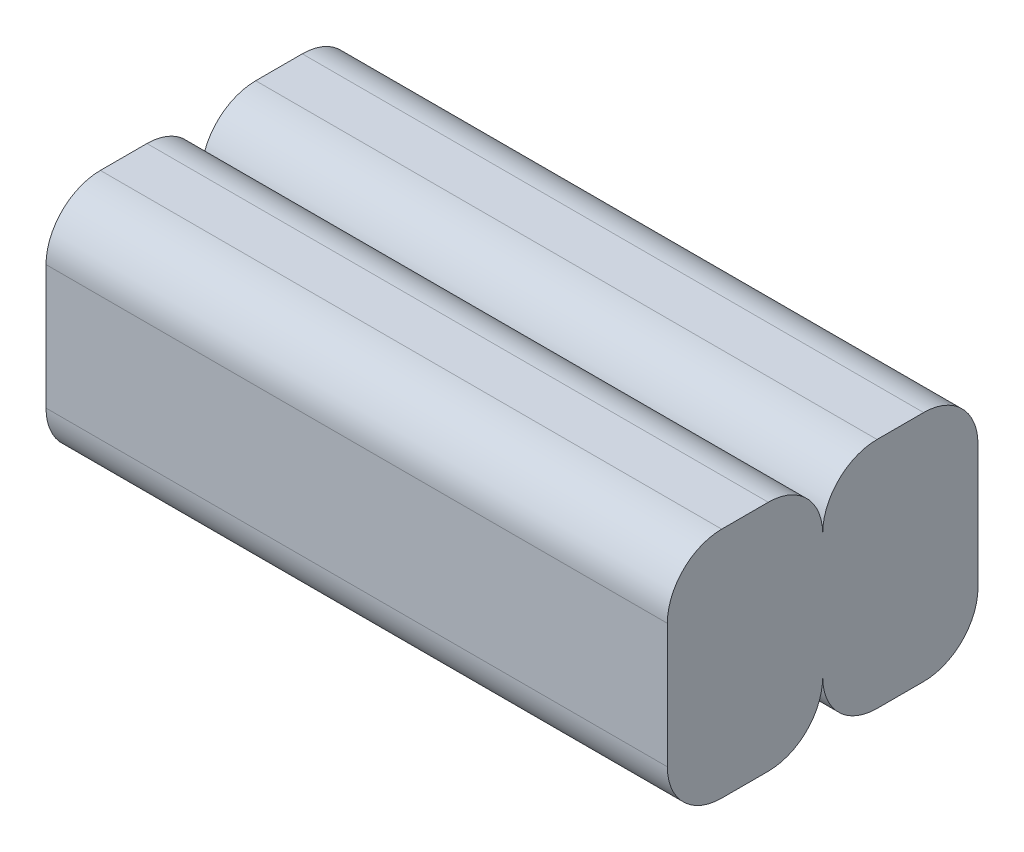
ISO-10303-21;
HEADER;
FILE_DESCRIPTION(('STEP AP214'),'2;1');
FILE_NAME('part.step','',(''),(''),'','','');
FILE_SCHEMA(('AUTOMOTIVE_DESIGN { 1 0 10303 214 1 1 1 1 }'));
ENDSEC;
DATA;
#1=APPLICATION_CONTEXT('core data for automotive mechanical design processes');
#2=APPLICATION_PROTOCOL_DEFINITION('international standard','automotive_design',2000,#1);
#3=PRODUCT_CONTEXT('',#1,'mechanical');
#4=PRODUCT('Part','Part','',(#3));
#5=PRODUCT_RELATED_PRODUCT_CATEGORY('part','',(#4));
#6=PRODUCT_DEFINITION_FORMATION('','',#4);
#7=PRODUCT_DEFINITION_CONTEXT('part definition',#1,'design');
#8=PRODUCT_DEFINITION('design','',#6,#7);
#9=PRODUCT_DEFINITION_SHAPE('','',#8);
#10=(LENGTH_UNIT() NAMED_UNIT(*) SI_UNIT(.MILLI.,.METRE.));
#11=(NAMED_UNIT(*) PLANE_ANGLE_UNIT() SI_UNIT($,.RADIAN.));
#12=(NAMED_UNIT(*) SI_UNIT($,.STERADIAN.) SOLID_ANGLE_UNIT());
#13=UNCERTAINTY_MEASURE_WITH_UNIT(LENGTH_MEASURE(1.E-05),#10,'distance_accuracy_value','');
#14=(GEOMETRIC_REPRESENTATION_CONTEXT(3) GLOBAL_UNCERTAINTY_ASSIGNED_CONTEXT((#13)) GLOBAL_UNIT_ASSIGNED_CONTEXT((#10,
#11,#12)) REPRESENTATION_CONTEXT('',''));
#15=CARTESIAN_POINT('',(0.,0.,0.));
#16=DIRECTION('',(0.,0.,1.));
#17=DIRECTION('',(1.,0.,0.));
#18=AXIS2_PLACEMENT_3D('',#15,#16,#17);
#19=CARTESIAN_POINT('',(80.,-8.,13.));
#20=DIRECTION('',(1.,0.,0.));
#21=DIRECTION('',(0.,0.,-1.));
#22=AXIS2_PLACEMENT_3D('',#19,#20,#21);
#23=CYLINDRICAL_SURFACE('',#22,7.);
#24=DIRECTION('',(1.,0.,0.));
#25=VECTOR('',#24,1.);
#26=CARTESIAN_POINT('',(80.,-8.,20.));
#27=LINE('',#26,#25);
#28=CARTESIAN_POINT('',(0.,-8.,20.));
#29=VERTEX_POINT('',#28);
#30=CARTESIAN_POINT('',(80.,-8.,20.));
#31=VERTEX_POINT('',#30);
#32=EDGE_CURVE('E237',#29,#31,#27,.T.);
#33=ORIENTED_EDGE('',*,*,#32,.F.);
#34=CARTESIAN_POINT('',(0.,-8.,13.));
#35=DIRECTION('',(1.,0.,0.));
#36=DIRECTION('',(0.,0.,-1.));
#37=AXIS2_PLACEMENT_3D('',#34,#35,#36);
#38=CIRCLE('',#37,7.);
#39=CARTESIAN_POINT('',(0.,-15.,13.));
#40=VERTEX_POINT('',#39);
#41=EDGE_CURVE('E45',#40,#29,#38,.F.);
#42=ORIENTED_EDGE('',*,*,#41,.F.);
#43=DIRECTION('',(1.,0.,0.));
#44=VECTOR('',#43,1.);
#45=CARTESIAN_POINT('',(80.,-15.,13.));
#46=LINE('',#45,#44);
#47=CARTESIAN_POINT('',(80.,-15.,13.));
#48=VERTEX_POINT('',#47);
#49=EDGE_CURVE('E240',#48,#40,#46,.F.);
#50=ORIENTED_EDGE('',*,*,#49,.F.);
#51=CARTESIAN_POINT('',(80.,-8.,13.));
#52=DIRECTION('',(1.,0.,0.));
#53=DIRECTION('',(0.,0.,-1.));
#54=AXIS2_PLACEMENT_3D('',#51,#52,#53);
#55=CIRCLE('',#54,7.);
#56=EDGE_CURVE('E11',#31,#48,#55,.T.);
#57=ORIENTED_EDGE('',*,*,#56,.F.);
#58=EDGE_LOOP('',(#33,#42,#50,#57));
#59=FACE_BOUND('',#58,.T.);
#60=ADVANCED_FACE('F38',(#59),#23,.T.);
#61=CARTESIAN_POINT('',(80.,-8.,-13.));
#62=DIRECTION('',(-1.,0.,0.));
#63=DIRECTION('',(0.,0.,1.));
#64=AXIS2_PLACEMENT_3D('',#61,#62,#63);
#65=CYLINDRICAL_SURFACE('',#64,7.);
#66=DIRECTION('',(-1.,0.,0.));
#67=VECTOR('',#66,1.);
#68=CARTESIAN_POINT('',(80.,-8.,-20.));
#69=LINE('',#68,#67);
#70=CARTESIAN_POINT('',(80.,-8.,-20.));
#71=VERTEX_POINT('',#70);
#72=CARTESIAN_POINT('',(0.,-8.,-20.));
#73=VERTEX_POINT('',#72);
#74=EDGE_CURVE('E227',#71,#73,#69,.T.);
#75=ORIENTED_EDGE('',*,*,#74,.F.);
#76=CARTESIAN_POINT('',(80.,-8.,-13.));
#77=DIRECTION('',(1.,0.,0.));
#78=DIRECTION('',(0.,0.,-1.));
#79=AXIS2_PLACEMENT_3D('',#76,#77,#78);
#80=CIRCLE('',#79,7.);
#81=CARTESIAN_POINT('',(80.,-15.,-13.));
#82=VERTEX_POINT('',#81);
#83=EDGE_CURVE('E233',#82,#71,#80,.T.);
#84=ORIENTED_EDGE('',*,*,#83,.F.);
#85=DIRECTION('',(-1.,0.,0.));
#86=VECTOR('',#85,1.);
#87=CARTESIAN_POINT('',(80.,-15.,-13.));
#88=LINE('',#87,#86);
#89=CARTESIAN_POINT('',(0.,-15.,-13.));
#90=VERTEX_POINT('',#89);
#91=EDGE_CURVE('E230',#90,#82,#88,.F.);
#92=ORIENTED_EDGE('',*,*,#91,.F.);
#93=CARTESIAN_POINT('',(0.,-8.,-13.));
#94=DIRECTION('',(1.,0.,0.));
#95=DIRECTION('',(0.,0.,-1.));
#96=AXIS2_PLACEMENT_3D('',#93,#94,#95);
#97=CIRCLE('',#96,7.);
#98=EDGE_CURVE('E235',#73,#90,#97,.F.);
#99=ORIENTED_EDGE('',*,*,#98,.F.);
#100=EDGE_LOOP('',(#75,#84,#92,#99));
#101=FACE_BOUND('',#100,.T.);
#102=ADVANCED_FACE('F285',(#101),#65,.T.);
#103=CARTESIAN_POINT('',(80.,8.,13.));
#104=DIRECTION('',(1.,0.,0.));
#105=DIRECTION('',(0.,0.,-1.));
#106=AXIS2_PLACEMENT_3D('',#103,#104,#105);
#107=CYLINDRICAL_SURFACE('',#106,7.);
#108=DIRECTION('',(1.,0.,0.));
#109=VECTOR('',#108,1.);
#110=CARTESIAN_POINT('',(80.,15.,13.));
#111=LINE('',#110,#109);
#112=CARTESIAN_POINT('',(0.,15.,13.));
#113=VERTEX_POINT('',#112);
#114=CARTESIAN_POINT('',(80.,15.,13.));
#115=VERTEX_POINT('',#114);
#116=EDGE_CURVE('E217',#113,#115,#111,.T.);
#117=ORIENTED_EDGE('',*,*,#116,.F.);
#118=CARTESIAN_POINT('',(0.,8.,13.));
#119=DIRECTION('',(1.,0.,0.));
#120=DIRECTION('',(0.,0.,-1.));
#121=AXIS2_PLACEMENT_3D('',#118,#119,#120);
#122=CIRCLE('',#121,7.);
#123=CARTESIAN_POINT('',(0.,8.,20.));
#124=VERTEX_POINT('',#123);
#125=EDGE_CURVE('E223',#124,#113,#122,.F.);
#126=ORIENTED_EDGE('',*,*,#125,.F.);
#127=DIRECTION('',(1.,0.,0.));
#128=VECTOR('',#127,1.);
#129=CARTESIAN_POINT('',(80.,8.,20.));
#130=LINE('',#129,#128);
#131=CARTESIAN_POINT('',(80.,8.,20.));
#132=VERTEX_POINT('',#131);
#133=EDGE_CURVE('E220',#132,#124,#130,.F.);
#134=ORIENTED_EDGE('',*,*,#133,.F.);
#135=CARTESIAN_POINT('',(80.,8.,13.));
#136=DIRECTION('',(1.,0.,0.));
#137=DIRECTION('',(0.,0.,-1.));
#138=AXIS2_PLACEMENT_3D('',#135,#136,#137);
#139=CIRCLE('',#138,7.);
#140=EDGE_CURVE('E225',#115,#132,#139,.T.);
#141=ORIENTED_EDGE('',*,*,#140,.F.);
#142=EDGE_LOOP('',(#117,#126,#134,#141));
#143=FACE_BOUND('',#142,.T.);
#144=ADVANCED_FACE('F250',(#143),#107,.T.);
#145=CARTESIAN_POINT('',(80.,8.,-13.));
#146=DIRECTION('',(-1.,0.,0.));
#147=DIRECTION('',(0.,0.,1.));
#148=AXIS2_PLACEMENT_3D('',#145,#146,#147);
#149=CYLINDRICAL_SURFACE('',#148,7.);
#150=DIRECTION('',(-1.,0.,0.));
#151=VECTOR('',#150,1.);
#152=CARTESIAN_POINT('',(80.,15.,-13.));
#153=LINE('',#152,#151);
#154=CARTESIAN_POINT('',(80.,15.,-13.));
#155=VERTEX_POINT('',#154);
#156=CARTESIAN_POINT('',(0.,15.,-13.));
#157=VERTEX_POINT('',#156);
#158=EDGE_CURVE('E149',#155,#157,#153,.T.);
#159=ORIENTED_EDGE('',*,*,#158,.F.);
#160=CARTESIAN_POINT('',(80.,8.,-13.));
#161=DIRECTION('',(1.,0.,0.));
#162=DIRECTION('',(0.,0.,-1.));
#163=AXIS2_PLACEMENT_3D('',#160,#161,#162);
#164=CIRCLE('',#163,7.);
#165=CARTESIAN_POINT('',(80.,8.,-20.));
#166=VERTEX_POINT('',#165);
#167=EDGE_CURVE('E212',#166,#155,#164,.T.);
#168=ORIENTED_EDGE('',*,*,#167,.F.);
#169=DIRECTION('',(-1.,0.,0.));
#170=VECTOR('',#169,1.);
#171=CARTESIAN_POINT('',(80.,8.,-20.));
#172=LINE('',#171,#170);
#173=CARTESIAN_POINT('',(0.,8.,-20.));
#174=VERTEX_POINT('',#173);
#175=EDGE_CURVE('E209',#174,#166,#172,.F.);
#176=ORIENTED_EDGE('',*,*,#175,.F.);
#177=CARTESIAN_POINT('',(0.,8.,-13.));
#178=DIRECTION('',(1.,0.,0.));
#179=DIRECTION('',(0.,0.,-1.));
#180=AXIS2_PLACEMENT_3D('',#177,#178,#179);
#181=CIRCLE('',#180,7.);
#182=EDGE_CURVE('E214',#157,#174,#181,.F.);
#183=ORIENTED_EDGE('',*,*,#182,.F.);
#184=EDGE_LOOP('',(#159,#168,#176,#183));
#185=FACE_BOUND('',#184,.T.);
#186=ADVANCED_FACE('F276',(#185),#149,.T.);
#187=CARTESIAN_POINT('',(80.,15.,7.00000000000001));
#188=DIRECTION('',(0.,-1.,0.));
#189=DIRECTION('',(0.,0.,-1.));
#190=AXIS2_PLACEMENT_3D('',#187,#188,#189);
#191=PLANE('',#190);
#192=DIRECTION('',(0.,0.,1.));
#193=VECTOR('',#192,1.);
#194=CARTESIAN_POINT('',(0.,15.,7.00000000000001));
#195=LINE('',#194,#193);
#196=CARTESIAN_POINT('',(0.,15.,7.00000000000001));
#197=VERTEX_POINT('',#196);
#198=EDGE_CURVE('E172',#197,#113,#195,.T.);
#199=ORIENTED_EDGE('',*,*,#198,.T.);
#200=ORIENTED_EDGE('',*,*,#116,.T.);
#201=DIRECTION('',(0.,0.,1.));
#202=VECTOR('',#201,1.);
#203=CARTESIAN_POINT('',(80.,15.,7.00000000000001));
#204=LINE('',#203,#202);
#205=CARTESIAN_POINT('',(80.,15.,7.00000000000001));
#206=VERTEX_POINT('',#205);
#207=EDGE_CURVE('E194',#206,#115,#204,.T.);
#208=ORIENTED_EDGE('',*,*,#207,.F.);
#209=DIRECTION('',(-1.,0.,0.));
#210=VECTOR('',#209,1.);
#211=CARTESIAN_POINT('',(80.,15.,7.00000000000001));
#212=LINE('',#211,#210);
#213=EDGE_CURVE('E171',#206,#197,#212,.T.);
#214=ORIENTED_EDGE('',*,*,#213,.T.);
#215=EDGE_LOOP('',(#199,#200,#208,#214));
#216=FACE_BOUND('',#215,.T.);
#217=ADVANCED_FACE('F255',(#216),#191,.F.);
#218=CARTESIAN_POINT('',(80.,-15.,20.));
#219=DIRECTION('',(0.,0.,-1.));
#220=DIRECTION('',(-1.,0.,0.));
#221=AXIS2_PLACEMENT_3D('',#218,#219,#220);
#222=PLANE('',#221);
#223=DIRECTION('',(0.,-1.,0.));
#224=VECTOR('',#223,1.);
#225=CARTESIAN_POINT('',(0.,-15.,20.));
#226=LINE('',#225,#224);
#227=EDGE_CURVE('E175',#124,#29,#226,.T.);
#228=ORIENTED_EDGE('',*,*,#227,.T.);
#229=ORIENTED_EDGE('',*,*,#32,.T.);
#230=DIRECTION('',(0.,-1.,0.));
#231=VECTOR('',#230,1.);
#232=CARTESIAN_POINT('',(80.,-15.,20.));
#233=LINE('',#232,#231);
#234=EDGE_CURVE('E140',#132,#31,#233,.T.);
#235=ORIENTED_EDGE('',*,*,#234,.F.);
#236=ORIENTED_EDGE('',*,*,#133,.T.);
#237=EDGE_LOOP('',(#228,#229,#235,#236));
#238=FACE_BOUND('',#237,.T.);
#239=ADVANCED_FACE('F246',(#238),#222,.F.);
#240=CARTESIAN_POINT('',(80.,-15.,7.00000000000001));
#241=DIRECTION('',(0.,1.,0.));
#242=DIRECTION('',(0.,0.,1.));
#243=AXIS2_PLACEMENT_3D('',#240,#241,#242);
#244=PLANE('',#243);
#245=DIRECTION('',(0.,0.,-1.));
#246=VECTOR('',#245,1.);
#247=CARTESIAN_POINT('',(80.,-15.,7.00000000000001));
#248=LINE('',#247,#246);
#249=CARTESIAN_POINT('',(80.,-15.,7.00000000000001));
#250=VERTEX_POINT('',#249);
#251=EDGE_CURVE('E133',#48,#250,#248,.T.);
#252=ORIENTED_EDGE('',*,*,#251,.F.);
#253=ORIENTED_EDGE('',*,*,#49,.T.);
#254=DIRECTION('',(0.,0.,-1.));
#255=VECTOR('',#254,1.);
#256=CARTESIAN_POINT('',(0.,-15.,7.00000000000001));
#257=LINE('',#256,#255);
#258=CARTESIAN_POINT('',(0.,-15.,7.00000000000001));
#259=VERTEX_POINT('',#258);
#260=EDGE_CURVE('E146',#40,#259,#257,.T.);
#261=ORIENTED_EDGE('',*,*,#260,.T.);
#262=DIRECTION('',(-1.,0.,0.));
#263=VECTOR('',#262,1.);
#264=CARTESIAN_POINT('',(80.,-15.,7.00000000000001));
#265=LINE('',#264,#263);
#266=EDGE_CURVE('E143',#250,#259,#265,.T.);
#267=ORIENTED_EDGE('',*,*,#266,.F.);
#268=EDGE_LOOP('',(#252,#253,#261,#267));
#269=FACE_BOUND('',#268,.T.);
#270=ADVANCED_FACE('F144',(#269),#244,.F.);
#271=CARTESIAN_POINT('',(80.,-7.99999999999999,7.00000000000001));
#272=DIRECTION('',(-1.,0.,0.));
#273=DIRECTION('',(0.,0.,1.));
#274=AXIS2_PLACEMENT_3D('',#271,#272,#273);
#275=CYLINDRICAL_SURFACE('',#274,7.00000000000001);
#276=CARTESIAN_POINT('',(0.,-7.99999999999999,7.00000000000001));
#277=DIRECTION('',(1.,0.,0.));
#278=DIRECTION('',(0.,0.,-1.));
#279=AXIS2_PLACEMENT_3D('',#276,#277,#278);
#280=CIRCLE('',#279,7.00000000000001);
#281=CARTESIAN_POINT('',(0.,-7.99999999999999,0.));
#282=VERTEX_POINT('',#281);
#283=EDGE_CURVE('E179',#259,#282,#280,.T.);
#284=ORIENTED_EDGE('',*,*,#283,.T.);
#285=DIRECTION('',(-1.,0.,0.));
#286=VECTOR('',#285,1.);
#287=CARTESIAN_POINT('',(80.,-7.99999999999999,0.));
#288=LINE('',#287,#286);
#289=CARTESIAN_POINT('',(80.,-7.99999999999999,0.));
#290=VERTEX_POINT('',#289);
#291=EDGE_CURVE('E150',#290,#282,#288,.T.);
#292=ORIENTED_EDGE('',*,*,#291,.F.);
#293=CARTESIAN_POINT('',(80.,-7.99999999999999,7.00000000000001));
#294=DIRECTION('',(1.,0.,0.));
#295=DIRECTION('',(0.,0.,-1.));
#296=AXIS2_PLACEMENT_3D('',#293,#294,#295);
#297=CIRCLE('',#296,7.00000000000001);
#298=EDGE_CURVE('E137',#250,#290,#297,.T.);
#299=ORIENTED_EDGE('',*,*,#298,.F.);
#300=ORIENTED_EDGE('',*,*,#266,.T.);
#301=EDGE_LOOP('',(#284,#292,#299,#300));
#302=FACE_BOUND('',#301,.T.);
#303=ADVANCED_FACE('F152',(#302),#275,.T.);
#304=CARTESIAN_POINT('',(80.,-8.,-7.));
#305=DIRECTION('',(-1.,0.,0.));
#306=DIRECTION('',(0.,0.,1.));
#307=AXIS2_PLACEMENT_3D('',#304,#305,#306);
#308=CYLINDRICAL_SURFACE('',#307,7.);
#309=CARTESIAN_POINT('',(0.,-8.,-7.));
#310=DIRECTION('',(1.,0.,0.));
#311=DIRECTION('',(0.,0.,1.));
#312=AXIS2_PLACEMENT_3D('',#309,#310,#311);
#313=CIRCLE('',#312,7.);
#314=CARTESIAN_POINT('',(0.,-15.,-7.));
#315=VERTEX_POINT('',#314);
#316=EDGE_CURVE('E181',#282,#315,#313,.T.);
#317=ORIENTED_EDGE('',*,*,#316,.T.);
#318=DIRECTION('',(-1.,0.,0.));
#319=VECTOR('',#318,1.);
#320=CARTESIAN_POINT('',(80.,-15.,-7.));
#321=LINE('',#320,#319);
#322=CARTESIAN_POINT('',(80.,-15.,-7.));
#323=VERTEX_POINT('',#322);
#324=EDGE_CURVE('E203',#323,#315,#321,.T.);
#325=ORIENTED_EDGE('',*,*,#324,.F.);
#326=CARTESIAN_POINT('',(80.,-8.,-7.));
#327=DIRECTION('',(1.,0.,0.));
#328=DIRECTION('',(0.,0.,1.));
#329=AXIS2_PLACEMENT_3D('',#326,#327,#328);
#330=CIRCLE('',#329,7.);
#331=EDGE_CURVE('E155',#290,#323,#330,.T.);
#332=ORIENTED_EDGE('',*,*,#331,.F.);
#333=ORIENTED_EDGE('',*,*,#291,.T.);
#334=EDGE_LOOP('',(#317,#325,#332,#333));
#335=FACE_BOUND('',#334,.T.);
#336=ADVANCED_FACE('F291',(#335),#308,.T.);
#337=CARTESIAN_POINT('',(80.,-15.,-20.));
#338=DIRECTION('',(0.,1.,0.));
#339=DIRECTION('',(0.,0.,1.));
#340=AXIS2_PLACEMENT_3D('',#337,#338,#339);
#341=PLANE('',#340);
#342=DIRECTION('',(0.,0.,-1.));
#343=VECTOR('',#342,1.);
#344=CARTESIAN_POINT('',(0.,-15.,-20.));
#345=LINE('',#344,#343);
#346=EDGE_CURVE('E183',#315,#90,#345,.T.);
#347=ORIENTED_EDGE('',*,*,#346,.T.);
#348=ORIENTED_EDGE('',*,*,#91,.T.);
#349=DIRECTION('',(0.,0.,-1.));
#350=VECTOR('',#349,1.);
#351=CARTESIAN_POINT('',(80.,-15.,-20.));
#352=LINE('',#351,#350);
#353=EDGE_CURVE('E157',#323,#82,#352,.T.);
#354=ORIENTED_EDGE('',*,*,#353,.F.);
#355=ORIENTED_EDGE('',*,*,#324,.T.);
#356=EDGE_LOOP('',(#347,#348,#354,#355));
#357=FACE_BOUND('',#356,.T.);
#358=ADVANCED_FACE('F288',(#357),#341,.F.);
#359=CARTESIAN_POINT('',(80.,-15.,-20.));
#360=DIRECTION('',(0.,0.,1.));
#361=DIRECTION('',(1.,0.,0.));
#362=AXIS2_PLACEMENT_3D('',#359,#360,#361);
#363=PLANE('',#362);
#364=DIRECTION('',(0.,1.,0.));
#365=VECTOR('',#364,1.);
#366=CARTESIAN_POINT('',(80.,-15.,-20.));
#367=LINE('',#366,#365);
#368=EDGE_CURVE('E163',#71,#166,#367,.T.);
#369=ORIENTED_EDGE('',*,*,#368,.F.);
#370=ORIENTED_EDGE('',*,*,#74,.T.);
#371=DIRECTION('',(0.,1.,0.));
#372=VECTOR('',#371,1.);
#373=CARTESIAN_POINT('',(0.,-15.,-20.));
#374=LINE('',#373,#372);
#375=EDGE_CURVE('E186',#73,#174,#374,.T.);
#376=ORIENTED_EDGE('',*,*,#375,.T.);
#377=ORIENTED_EDGE('',*,*,#175,.T.);
#378=EDGE_LOOP('',(#369,#370,#376,#377));
#379=FACE_BOUND('',#378,.T.);
#380=ADVANCED_FACE('F279',(#379),#363,.F.);
#381=CARTESIAN_POINT('',(80.,15.,-20.));
#382=DIRECTION('',(0.,-1.,0.));
#383=DIRECTION('',(0.,0.,-1.));
#384=AXIS2_PLACEMENT_3D('',#381,#382,#383);
#385=PLANE('',#384);
#386=DIRECTION('',(0.,0.,1.));
#387=VECTOR('',#386,1.);
#388=CARTESIAN_POINT('',(80.,15.,-20.));
#389=LINE('',#388,#387);
#390=CARTESIAN_POINT('',(80.,15.,-7.));
#391=VERTEX_POINT('',#390);
#392=EDGE_CURVE('E165',#155,#391,#389,.T.);
#393=ORIENTED_EDGE('',*,*,#392,.F.);
#394=ORIENTED_EDGE('',*,*,#158,.T.);
#395=DIRECTION('',(0.,0.,1.));
#396=VECTOR('',#395,1.);
#397=CARTESIAN_POINT('',(0.,15.,-20.));
#398=LINE('',#397,#396);
#399=CARTESIAN_POINT('',(0.,15.,-7.));
#400=VERTEX_POINT('',#399);
#401=EDGE_CURVE('E188',#157,#400,#398,.T.);
#402=ORIENTED_EDGE('',*,*,#401,.T.);
#403=DIRECTION('',(-1.,0.,0.));
#404=VECTOR('',#403,1.);
#405=CARTESIAN_POINT('',(80.,15.,-7.));
#406=LINE('',#405,#404);
#407=EDGE_CURVE('E200',#391,#400,#406,.T.);
#408=ORIENTED_EDGE('',*,*,#407,.F.);
#409=EDGE_LOOP('',(#393,#394,#402,#408));
#410=FACE_BOUND('',#409,.T.);
#411=ADVANCED_FACE('F272',(#410),#385,.F.);
#412=CARTESIAN_POINT('',(80.,8.,-7.));
#413=DIRECTION('',(-1.,0.,0.));
#414=DIRECTION('',(0.,0.,1.));
#415=AXIS2_PLACEMENT_3D('',#412,#413,#414);
#416=CYLINDRICAL_SURFACE('',#415,7.);
#417=CARTESIAN_POINT('',(0.,8.,-7.));
#418=DIRECTION('',(1.,0.,0.));
#419=DIRECTION('',(0.,0.,-1.));
#420=AXIS2_PLACEMENT_3D('',#417,#418,#419);
#421=CIRCLE('',#420,7.);
#422=CARTESIAN_POINT('',(0.,8.,0.));
#423=VERTEX_POINT('',#422);
#424=EDGE_CURVE('E190',#400,#423,#421,.T.);
#425=ORIENTED_EDGE('',*,*,#424,.T.);
#426=DIRECTION('',(-1.,0.,0.));
#427=VECTOR('',#426,1.);
#428=CARTESIAN_POINT('',(80.,8.,0.));
#429=LINE('',#428,#427);
#430=CARTESIAN_POINT('',(80.,8.,0.));
#431=VERTEX_POINT('',#430);
#432=EDGE_CURVE('E197',#431,#423,#429,.T.);
#433=ORIENTED_EDGE('',*,*,#432,.F.);
#434=CARTESIAN_POINT('',(80.,8.,-7.));
#435=DIRECTION('',(1.,0.,0.));
#436=DIRECTION('',(0.,0.,-1.));
#437=AXIS2_PLACEMENT_3D('',#434,#435,#436);
#438=CIRCLE('',#437,7.);
#439=EDGE_CURVE('E167',#391,#431,#438,.T.);
#440=ORIENTED_EDGE('',*,*,#439,.F.);
#441=ORIENTED_EDGE('',*,*,#407,.T.);
#442=EDGE_LOOP('',(#425,#433,#440,#441));
#443=FACE_BOUND('',#442,.T.);
#444=ADVANCED_FACE('F265',(#443),#416,.T.);
#445=CARTESIAN_POINT('',(80.,7.99999999999999,7.00000000000001));
#446=DIRECTION('',(-1.,0.,0.));
#447=DIRECTION('',(0.,0.,1.));
#448=AXIS2_PLACEMENT_3D('',#445,#446,#447);
#449=CYLINDRICAL_SURFACE('',#448,7.00000000000001);
#450=CARTESIAN_POINT('',(0.,7.99999999999999,7.00000000000001));
#451=DIRECTION('',(1.,0.,0.));
#452=DIRECTION('',(0.,0.,1.));
#453=AXIS2_PLACEMENT_3D('',#450,#451,#452);
#454=CIRCLE('',#453,7.00000000000001);
#455=EDGE_CURVE('E192',#423,#197,#454,.T.);
#456=ORIENTED_EDGE('',*,*,#455,.T.);
#457=ORIENTED_EDGE('',*,*,#213,.F.);
#458=CARTESIAN_POINT('',(80.,7.99999999999999,7.00000000000001));
#459=DIRECTION('',(1.,0.,0.));
#460=DIRECTION('',(0.,0.,1.));
#461=AXIS2_PLACEMENT_3D('',#458,#459,#460);
#462=CIRCLE('',#461,7.00000000000001);
#463=EDGE_CURVE('E169',#431,#206,#462,.T.);
#464=ORIENTED_EDGE('',*,*,#463,.F.);
#465=ORIENTED_EDGE('',*,*,#432,.T.);
#466=EDGE_LOOP('',(#456,#457,#464,#465));
#467=FACE_BOUND('',#466,.T.);
#468=ADVANCED_FACE('F261',(#467),#449,.T.);
#469=CARTESIAN_POINT('',(80.,-7.99999999999999,7.00000000000001));
#470=DIRECTION('',(1.,0.,0.));
#471=DIRECTION('',(0.,0.,-1.));
#472=AXIS2_PLACEMENT_3D('',#469,#470,#471);
#473=PLANE('',#472);
#474=ORIENTED_EDGE('',*,*,#234,.T.);
#475=ORIENTED_EDGE('',*,*,#56,.T.);
#476=ORIENTED_EDGE('',*,*,#251,.T.);
#477=ORIENTED_EDGE('',*,*,#298,.T.);
#478=ORIENTED_EDGE('',*,*,#331,.T.);
#479=ORIENTED_EDGE('',*,*,#353,.T.);
#480=ORIENTED_EDGE('',*,*,#83,.T.);
#481=ORIENTED_EDGE('',*,*,#368,.T.);
#482=ORIENTED_EDGE('',*,*,#167,.T.);
#483=ORIENTED_EDGE('',*,*,#392,.T.);
#484=ORIENTED_EDGE('',*,*,#439,.T.);
#485=ORIENTED_EDGE('',*,*,#463,.T.);
#486=ORIENTED_EDGE('',*,*,#207,.T.);
#487=ORIENTED_EDGE('',*,*,#140,.T.);
#488=EDGE_LOOP('',(#474,#475,#476,#477,#478,#479,#480,#481,#482,#483,#484,#485,#486,#487));
#489=FACE_BOUND('',#488,.T.);
#490=ADVANCED_FACE('F135',(#489),#473,.T.);
#491=CARTESIAN_POINT('',(0.,-7.99999999999999,7.00000000000001));
#492=DIRECTION('',(1.,0.,0.));
#493=DIRECTION('',(0.,0.,-1.));
#494=AXIS2_PLACEMENT_3D('',#491,#492,#493);
#495=PLANE('',#494);
#496=ORIENTED_EDGE('',*,*,#260,.F.);
#497=ORIENTED_EDGE('',*,*,#41,.T.);
#498=ORIENTED_EDGE('',*,*,#227,.F.);
#499=ORIENTED_EDGE('',*,*,#125,.T.);
#500=ORIENTED_EDGE('',*,*,#198,.F.);
#501=ORIENTED_EDGE('',*,*,#455,.F.);
#502=ORIENTED_EDGE('',*,*,#424,.F.);
#503=ORIENTED_EDGE('',*,*,#401,.F.);
#504=ORIENTED_EDGE('',*,*,#182,.T.);
#505=ORIENTED_EDGE('',*,*,#375,.F.);
#506=ORIENTED_EDGE('',*,*,#98,.T.);
#507=ORIENTED_EDGE('',*,*,#346,.F.);
#508=ORIENTED_EDGE('',*,*,#316,.F.);
#509=ORIENTED_EDGE('',*,*,#283,.F.);
#510=EDGE_LOOP('',(#496,#497,#498,#499,#500,#501,#502,#503,#504,#505,#506,#507,#508,#509));
#511=FACE_BOUND('',#510,.T.);
#512=ADVANCED_FACE('F243',(#511),#495,.F.);
#513=CLOSED_SHELL('',(#60,#102,#144,#186,#217,#239,#270,#303,#336,#358,#380,#411,#444,#468,#490,#512));
#514=MANIFOLD_SOLID_BREP('B2',#513);
#515=ADVANCED_BREP_SHAPE_REPRESENTATION('',(#18,#514),#14);
#516=SHAPE_DEFINITION_REPRESENTATION(#9,#515);
ENDSEC;
END-ISO-10303-21;
